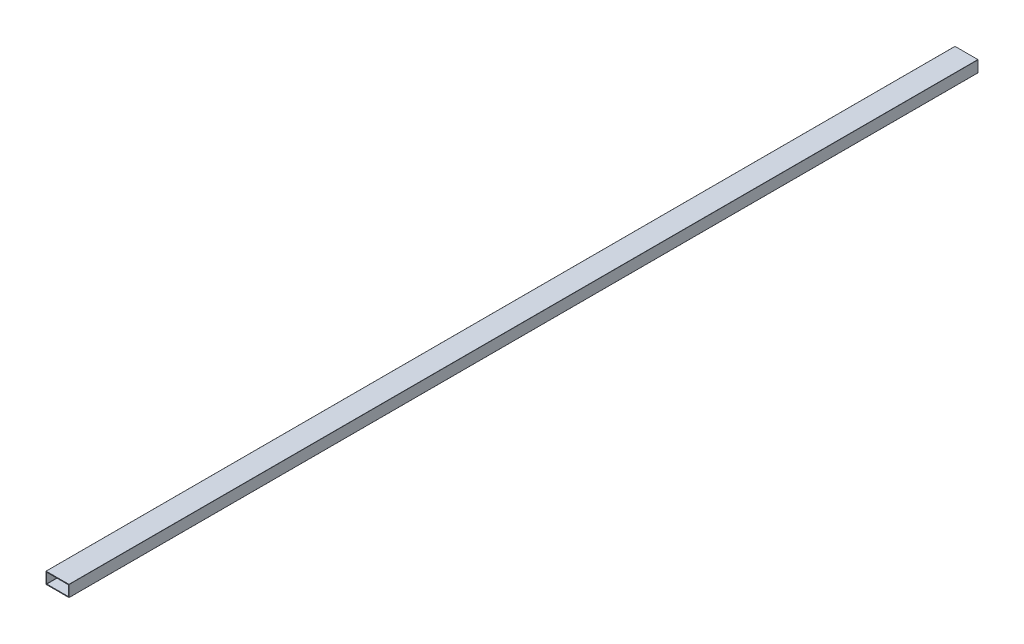
ISO-10303-21;
HEADER;
FILE_DESCRIPTION(('STEP AP214'),'2;1');
FILE_NAME('part.step','',(''),(''),'','','');
FILE_SCHEMA(('AUTOMOTIVE_DESIGN { 1 0 10303 214 1 1 1 1 }'));
ENDSEC;
DATA;
#1=APPLICATION_CONTEXT('core data for automotive mechanical design processes');
#2=APPLICATION_PROTOCOL_DEFINITION('international standard','automotive_design',2000,#1);
#3=PRODUCT_CONTEXT('',#1,'mechanical');
#4=PRODUCT('Part','Part','',(#3));
#5=PRODUCT_RELATED_PRODUCT_CATEGORY('part','',(#4));
#6=PRODUCT_DEFINITION_FORMATION('','',#4);
#7=PRODUCT_DEFINITION_CONTEXT('part definition',#1,'design');
#8=PRODUCT_DEFINITION('design','',#6,#7);
#9=PRODUCT_DEFINITION_SHAPE('','',#8);
#10=(LENGTH_UNIT() NAMED_UNIT(*) SI_UNIT(.MILLI.,.METRE.));
#11=(NAMED_UNIT(*) PLANE_ANGLE_UNIT() SI_UNIT($,.RADIAN.));
#12=(NAMED_UNIT(*) SI_UNIT($,.STERADIAN.) SOLID_ANGLE_UNIT());
#13=UNCERTAINTY_MEASURE_WITH_UNIT(LENGTH_MEASURE(1.E-05),#10,'distance_accuracy_value','');
#14=(GEOMETRIC_REPRESENTATION_CONTEXT(3) GLOBAL_UNCERTAINTY_ASSIGNED_CONTEXT((#13)) GLOBAL_UNIT_ASSIGNED_CONTEXT((#10,
#11,#12)) REPRESENTATION_CONTEXT('',''));
#15=CARTESIAN_POINT('',(0.,0.,0.));
#16=DIRECTION('',(0.,0.,1.));
#17=DIRECTION('',(1.,0.,0.));
#18=AXIS2_PLACEMENT_3D('',#15,#16,#17);
#19=CARTESIAN_POINT('',(76.2,-38.1,-6000.));
#20=DIRECTION('',(1.,0.,0.));
#21=DIRECTION('',(0.,0.,-1.));
#22=AXIS2_PLACEMENT_3D('',#19,#20,#21);
#23=PLANE('',#22);
#24=DIRECTION('',(0.,1.,0.));
#25=VECTOR('',#24,1.);
#26=CARTESIAN_POINT('',(76.2,-38.1,0.));
#27=LINE('',#26,#25);
#28=CARTESIAN_POINT('',(76.2,-37.1,0.));
#29=VERTEX_POINT('',#28);
#30=CARTESIAN_POINT('',(76.2,37.1,0.));
#31=VERTEX_POINT('',#30);
#32=EDGE_CURVE('E197',#29,#31,#27,.T.);
#33=ORIENTED_EDGE('',*,*,#32,.F.);
#34=DIRECTION('',(0.,0.,1.));
#35=VECTOR('',#34,1.);
#36=CARTESIAN_POINT('',(76.2,-37.1,-6000.));
#37=LINE('',#36,#35);
#38=CARTESIAN_POINT('',(76.2,-37.1,-6000.));
#39=VERTEX_POINT('',#38);
#40=EDGE_CURVE('E158',#29,#39,#37,.F.);
#41=ORIENTED_EDGE('',*,*,#40,.T.);
#42=DIRECTION('',(0.,1.,0.));
#43=VECTOR('',#42,1.);
#44=CARTESIAN_POINT('',(76.2,-38.1,-6000.));
#45=LINE('',#44,#43);
#46=CARTESIAN_POINT('',(76.2,37.1,-6000.));
#47=VERTEX_POINT('',#46);
#48=EDGE_CURVE('E185',#39,#47,#45,.T.);
#49=ORIENTED_EDGE('',*,*,#48,.T.);
#50=DIRECTION('',(0.,0.,1.));
#51=VECTOR('',#50,1.);
#52=CARTESIAN_POINT('',(76.2,37.1,-6000.));
#53=LINE('',#52,#51);
#54=EDGE_CURVE('E251',#47,#31,#53,.T.);
#55=ORIENTED_EDGE('',*,*,#54,.T.);
#56=EDGE_LOOP('',(#33,#41,#49,#55));
#57=FACE_BOUND('',#56,.T.);
#58=ADVANCED_FACE('F33',(#57),#23,.T.);
#59=CARTESIAN_POINT('',(-76.2,-38.1,-6000.));
#60=DIRECTION('',(0.,-1.,0.));
#61=DIRECTION('',(0.,0.,-1.));
#62=AXIS2_PLACEMENT_3D('',#59,#60,#61);
#63=PLANE('',#62);
#64=DIRECTION('',(1.,0.,0.));
#65=VECTOR('',#64,1.);
#66=CARTESIAN_POINT('',(-76.2,-38.1,0.));
#67=LINE('',#66,#65);
#68=CARTESIAN_POINT('',(-75.2,-38.1,0.));
#69=VERTEX_POINT('',#68);
#70=CARTESIAN_POINT('',(75.1999999999999,-38.1,0.));
#71=VERTEX_POINT('',#70);
#72=EDGE_CURVE('E189',#69,#71,#67,.T.);
#73=ORIENTED_EDGE('',*,*,#72,.F.);
#74=DIRECTION('',(0.,0.,1.));
#75=VECTOR('',#74,1.);
#76=CARTESIAN_POINT('',(-75.2,-38.1,-6000.));
#77=LINE('',#76,#75);
#78=CARTESIAN_POINT('',(-75.2,-38.1,-6000.));
#79=VERTEX_POINT('',#78);
#80=EDGE_CURVE('E238',#69,#79,#77,.F.);
#81=ORIENTED_EDGE('',*,*,#80,.T.);
#82=DIRECTION('',(1.,0.,0.));
#83=VECTOR('',#82,1.);
#84=CARTESIAN_POINT('',(-76.2,-38.1,-6000.));
#85=LINE('',#84,#83);
#86=CARTESIAN_POINT('',(75.1999999999999,-38.1,-6000.));
#87=VERTEX_POINT('',#86);
#88=EDGE_CURVE('E194',#79,#87,#85,.T.);
#89=ORIENTED_EDGE('',*,*,#88,.T.);
#90=DIRECTION('',(0.,0.,1.));
#91=VECTOR('',#90,1.);
#92=CARTESIAN_POINT('',(75.2,-38.1,-6000.));
#93=LINE('',#92,#91);
#94=EDGE_CURVE('E235',#87,#71,#93,.T.);
#95=ORIENTED_EDGE('',*,*,#94,.T.);
#96=EDGE_LOOP('',(#73,#81,#89,#95));
#97=FACE_BOUND('',#96,.T.);
#98=ADVANCED_FACE('F305',(#97),#63,.T.);
#99=CARTESIAN_POINT('',(-76.2,-38.1,-6000.));
#100=DIRECTION('',(-1.,0.,0.));
#101=DIRECTION('',(0.,0.,1.));
#102=AXIS2_PLACEMENT_3D('',#99,#100,#101);
#103=PLANE('',#102);
#104=DIRECTION('',(0.,-1.,0.));
#105=VECTOR('',#104,1.);
#106=CARTESIAN_POINT('',(-76.2,-38.1,-6000.));
#107=LINE('',#106,#105);
#108=CARTESIAN_POINT('',(-76.2,37.1,-6000.));
#109=VERTEX_POINT('',#108);
#110=CARTESIAN_POINT('',(-76.2,-37.1,-6000.));
#111=VERTEX_POINT('',#110);
#112=EDGE_CURVE('E191',#109,#111,#107,.T.);
#113=ORIENTED_EDGE('',*,*,#112,.T.);
#114=DIRECTION('',(0.,0.,1.));
#115=VECTOR('',#114,1.);
#116=CARTESIAN_POINT('',(-76.2,-37.1,-6000.));
#117=LINE('',#116,#115);
#118=CARTESIAN_POINT('',(-76.2,-37.1,0.));
#119=VERTEX_POINT('',#118);
#120=EDGE_CURVE('E224',#111,#119,#117,.T.);
#121=ORIENTED_EDGE('',*,*,#120,.T.);
#122=DIRECTION('',(0.,-1.,0.));
#123=VECTOR('',#122,1.);
#124=CARTESIAN_POINT('',(-76.2,-38.1,0.));
#125=LINE('',#124,#123);
#126=CARTESIAN_POINT('',(-76.2,37.1,0.));
#127=VERTEX_POINT('',#126);
#128=EDGE_CURVE('E203',#127,#119,#125,.T.);
#129=ORIENTED_EDGE('',*,*,#128,.F.);
#130=DIRECTION('',(0.,0.,1.));
#131=VECTOR('',#130,1.);
#132=CARTESIAN_POINT('',(-76.2,37.1,-6000.));
#133=LINE('',#132,#131);
#134=EDGE_CURVE('E222',#127,#109,#133,.F.);
#135=ORIENTED_EDGE('',*,*,#134,.T.);
#136=EDGE_LOOP('',(#113,#121,#129,#135));
#137=FACE_BOUND('',#136,.T.);
#138=ADVANCED_FACE('F311',(#137),#103,.T.);
#139=CARTESIAN_POINT('',(-76.2,38.1,-6000.));
#140=DIRECTION('',(0.,1.,0.));
#141=DIRECTION('',(0.,0.,1.));
#142=AXIS2_PLACEMENT_3D('',#139,#140,#141);
#143=PLANE('',#142);
#144=DIRECTION('',(-1.,0.,0.));
#145=VECTOR('',#144,1.);
#146=CARTESIAN_POINT('',(-76.2,38.1,-6000.));
#147=LINE('',#146,#145);
#148=CARTESIAN_POINT('',(75.1999999999999,38.1,-6000.));
#149=VERTEX_POINT('',#148);
#150=CARTESIAN_POINT('',(-75.2,38.1,-6000.));
#151=VERTEX_POINT('',#150);
#152=EDGE_CURVE('E188',#149,#151,#147,.T.);
#153=ORIENTED_EDGE('',*,*,#152,.T.);
#154=DIRECTION('',(0.,0.,1.));
#155=VECTOR('',#154,1.);
#156=CARTESIAN_POINT('',(-75.2,38.1,-6000.));
#157=LINE('',#156,#155);
#158=CARTESIAN_POINT('',(-75.2,38.1,0.));
#159=VERTEX_POINT('',#158);
#160=EDGE_CURVE('E248',#151,#159,#157,.T.);
#161=ORIENTED_EDGE('',*,*,#160,.T.);
#162=DIRECTION('',(-1.,0.,0.));
#163=VECTOR('',#162,1.);
#164=CARTESIAN_POINT('',(-76.2,38.1,0.));
#165=LINE('',#164,#163);
#166=CARTESIAN_POINT('',(75.1999999999999,38.1,0.));
#167=VERTEX_POINT('',#166);
#168=EDGE_CURVE('E200',#167,#159,#165,.T.);
#169=ORIENTED_EDGE('',*,*,#168,.F.);
#170=DIRECTION('',(0.,0.,1.));
#171=VECTOR('',#170,1.);
#172=CARTESIAN_POINT('',(75.2,38.1,-6000.));
#173=LINE('',#172,#171);
#174=EDGE_CURVE('E55',#167,#149,#173,.F.);
#175=ORIENTED_EDGE('',*,*,#174,.T.);
#176=EDGE_LOOP('',(#153,#161,#169,#175));
#177=FACE_BOUND('',#176,.T.);
#178=ADVANCED_FACE('F316',(#177),#143,.T.);
#179=CARTESIAN_POINT('',(0.,0.,-6000.));
#180=DIRECTION('',(0.,0.,-1.));
#181=DIRECTION('',(-1.,0.,0.));
#182=AXIS2_PLACEMENT_3D('',#179,#180,#181);
#183=PLANE('',#182);
#184=DIRECTION('',(0.,-1.,0.));
#185=VECTOR('',#184,1.);
#186=CARTESIAN_POINT('',(-71.65,-33.55,-6000.));
#187=LINE('',#186,#185);
#188=CARTESIAN_POINT('',(-71.65,32.55,-6000.));
#189=VERTEX_POINT('',#188);
#190=CARTESIAN_POINT('',(-71.65,-32.55,-6000.));
#191=VERTEX_POINT('',#190);
#192=EDGE_CURVE('E167',#189,#191,#187,.T.);
#193=ORIENTED_EDGE('',*,*,#192,.T.);
#194=CARTESIAN_POINT('',(-70.65,-32.55,-6000.));
#195=DIRECTION('',(0.,0.,-1.));
#196=DIRECTION('',(-1.,0.,0.));
#197=AXIS2_PLACEMENT_3D('',#194,#195,#196);
#198=CIRCLE('',#197,1.);
#199=CARTESIAN_POINT('',(-70.65,-33.55,-6000.));
#200=VERTEX_POINT('',#199);
#201=EDGE_CURVE('E11',#191,#200,#198,.F.);
#202=ORIENTED_EDGE('',*,*,#201,.T.);
#203=DIRECTION('',(1.,0.,0.));
#204=VECTOR('',#203,1.);
#205=CARTESIAN_POINT('',(-71.65,-33.55,-6000.));
#206=LINE('',#205,#204);
#207=CARTESIAN_POINT('',(70.65,-33.55,-6000.));
#208=VERTEX_POINT('',#207);
#209=EDGE_CURVE('E175',#200,#208,#206,.T.);
#210=ORIENTED_EDGE('',*,*,#209,.T.);
#211=CARTESIAN_POINT('',(70.65,-32.55,-6000.));
#212=DIRECTION('',(0.,0.,-1.));
#213=DIRECTION('',(-1.,0.,0.));
#214=AXIS2_PLACEMENT_3D('',#211,#212,#213);
#215=CIRCLE('',#214,1.);
#216=CARTESIAN_POINT('',(71.65,-32.55,-6000.));
#217=VERTEX_POINT('',#216);
#218=EDGE_CURVE('E262',#208,#217,#215,.F.);
#219=ORIENTED_EDGE('',*,*,#218,.T.);
#220=DIRECTION('',(0.,1.,0.));
#221=VECTOR('',#220,1.);
#222=CARTESIAN_POINT('',(71.65,-33.55,-6000.));
#223=LINE('',#222,#221);
#224=CARTESIAN_POINT('',(71.65,32.55,-6000.));
#225=VERTEX_POINT('',#224);
#226=EDGE_CURVE('E179',#217,#225,#223,.T.);
#227=ORIENTED_EDGE('',*,*,#226,.T.);
#228=CARTESIAN_POINT('',(70.65,32.55,-6000.));
#229=DIRECTION('',(0.,0.,-1.));
#230=DIRECTION('',(-1.,0.,0.));
#231=AXIS2_PLACEMENT_3D('',#228,#229,#230);
#232=CIRCLE('',#231,1.);
#233=CARTESIAN_POINT('',(70.65,33.55,-6000.));
#234=VERTEX_POINT('',#233);
#235=EDGE_CURVE('E258',#225,#234,#232,.F.);
#236=ORIENTED_EDGE('',*,*,#235,.T.);
#237=DIRECTION('',(-1.,0.,0.));
#238=VECTOR('',#237,1.);
#239=CARTESIAN_POINT('',(-71.65,33.55,-6000.));
#240=LINE('',#239,#238);
#241=CARTESIAN_POINT('',(-70.65,33.55,-6000.));
#242=VERTEX_POINT('',#241);
#243=EDGE_CURVE('E277',#234,#242,#240,.T.);
#244=ORIENTED_EDGE('',*,*,#243,.T.);
#245=CARTESIAN_POINT('',(-70.65,32.55,-6000.));
#246=DIRECTION('',(0.,0.,-1.));
#247=DIRECTION('',(-1.,0.,0.));
#248=AXIS2_PLACEMENT_3D('',#245,#246,#247);
#249=CIRCLE('',#248,1.);
#250=EDGE_CURVE('E157',#242,#189,#249,.F.);
#251=ORIENTED_EDGE('',*,*,#250,.T.);
#252=EDGE_LOOP('',(#193,#202,#210,#219,#227,#236,#244,#251));
#253=FACE_BOUND('',#252,.T.);
#254=ORIENTED_EDGE('',*,*,#88,.F.);
#255=CARTESIAN_POINT('',(-75.2,-37.1,-6000.));
#256=DIRECTION('',(0.,0.,-1.));
#257=DIRECTION('',(-1.,0.,0.));
#258=AXIS2_PLACEMENT_3D('',#255,#256,#257);
#259=CIRCLE('',#258,1.);
#260=EDGE_CURVE('E245',#79,#111,#259,.T.);
#261=ORIENTED_EDGE('',*,*,#260,.T.);
#262=ORIENTED_EDGE('',*,*,#112,.F.);
#263=CARTESIAN_POINT('',(-75.2,37.1,-6000.));
#264=DIRECTION('',(0.,0.,-1.));
#265=DIRECTION('',(-1.,0.,0.));
#266=AXIS2_PLACEMENT_3D('',#263,#264,#265);
#267=CIRCLE('',#266,1.);
#268=EDGE_CURVE('E48',#109,#151,#267,.T.);
#269=ORIENTED_EDGE('',*,*,#268,.T.);
#270=ORIENTED_EDGE('',*,*,#152,.F.);
#271=CARTESIAN_POINT('',(75.2,37.1,-6000.));
#272=DIRECTION('',(0.,0.,-1.));
#273=DIRECTION('',(-1.,0.,0.));
#274=AXIS2_PLACEMENT_3D('',#271,#272,#273);
#275=CIRCLE('',#274,1.);
#276=EDGE_CURVE('E240',#149,#47,#275,.T.);
#277=ORIENTED_EDGE('',*,*,#276,.T.);
#278=ORIENTED_EDGE('',*,*,#48,.F.);
#279=CARTESIAN_POINT('',(75.2,-37.1,-6000.));
#280=DIRECTION('',(0.,0.,-1.));
#281=DIRECTION('',(-1.,0.,0.));
#282=AXIS2_PLACEMENT_3D('',#279,#280,#281);
#283=CIRCLE('',#282,1.);
#284=EDGE_CURVE('E242',#39,#87,#283,.T.);
#285=ORIENTED_EDGE('',*,*,#284,.T.);
#286=EDGE_LOOP('',(#254,#261,#262,#269,#270,#277,#278,#285));
#287=FACE_BOUND('',#286,.T.);
#288=ADVANCED_FACE('F267',(#253,#287),#183,.T.);
#289=CARTESIAN_POINT('',(0.,0.,0.));
#290=DIRECTION('',(0.,0.,-1.));
#291=DIRECTION('',(-1.,0.,0.));
#292=AXIS2_PLACEMENT_3D('',#289,#290,#291);
#293=PLANE('',#292);
#294=DIRECTION('',(0.,1.,0.));
#295=VECTOR('',#294,1.);
#296=CARTESIAN_POINT('',(71.65,-33.55,0.));
#297=LINE('',#296,#295);
#298=CARTESIAN_POINT('',(71.65,-32.55,0.));
#299=VERTEX_POINT('',#298);
#300=CARTESIAN_POINT('',(71.65,32.55,0.));
#301=VERTEX_POINT('',#300);
#302=EDGE_CURVE('E181',#299,#301,#297,.T.);
#303=ORIENTED_EDGE('',*,*,#302,.F.);
#304=CARTESIAN_POINT('',(70.65,-32.55,0.));
#305=DIRECTION('',(0.,0.,-1.));
#306=DIRECTION('',(-1.,0.,0.));
#307=AXIS2_PLACEMENT_3D('',#304,#305,#306);
#308=CIRCLE('',#307,1.);
#309=CARTESIAN_POINT('',(70.65,-33.55,0.));
#310=VERTEX_POINT('',#309);
#311=EDGE_CURVE('E260',#299,#310,#308,.T.);
#312=ORIENTED_EDGE('',*,*,#311,.T.);
#313=DIRECTION('',(1.,0.,0.));
#314=VECTOR('',#313,1.);
#315=CARTESIAN_POINT('',(-71.65,-33.55,0.));
#316=LINE('',#315,#314);
#317=CARTESIAN_POINT('',(-70.65,-33.55,0.));
#318=VERTEX_POINT('',#317);
#319=EDGE_CURVE('E281',#318,#310,#316,.T.);
#320=ORIENTED_EDGE('',*,*,#319,.F.);
#321=CARTESIAN_POINT('',(-70.65,-32.55,0.));
#322=DIRECTION('',(0.,0.,-1.));
#323=DIRECTION('',(-1.,0.,0.));
#324=AXIS2_PLACEMENT_3D('',#321,#322,#323);
#325=CIRCLE('',#324,1.);
#326=CARTESIAN_POINT('',(-71.65,-32.55,0.));
#327=VERTEX_POINT('',#326);
#328=EDGE_CURVE('E41',#318,#327,#325,.T.);
#329=ORIENTED_EDGE('',*,*,#328,.T.);
#330=DIRECTION('',(0.,-1.,0.));
#331=VECTOR('',#330,1.);
#332=CARTESIAN_POINT('',(-71.65,-33.55,0.));
#333=LINE('',#332,#331);
#334=CARTESIAN_POINT('',(-71.65,32.55,0.));
#335=VERTEX_POINT('',#334);
#336=EDGE_CURVE('E164',#335,#327,#333,.T.);
#337=ORIENTED_EDGE('',*,*,#336,.F.);
#338=CARTESIAN_POINT('',(-70.65,32.55,0.));
#339=DIRECTION('',(0.,0.,-1.));
#340=DIRECTION('',(-1.,0.,0.));
#341=AXIS2_PLACEMENT_3D('',#338,#339,#340);
#342=CIRCLE('',#341,1.);
#343=CARTESIAN_POINT('',(-70.65,33.55,0.));
#344=VERTEX_POINT('',#343);
#345=EDGE_CURVE('E147',#335,#344,#342,.T.);
#346=ORIENTED_EDGE('',*,*,#345,.T.);
#347=DIRECTION('',(-1.,0.,0.));
#348=VECTOR('',#347,1.);
#349=CARTESIAN_POINT('',(-71.65,33.55,0.));
#350=LINE('',#349,#348);
#351=CARTESIAN_POINT('',(70.65,33.55,0.));
#352=VERTEX_POINT('',#351);
#353=EDGE_CURVE('E176',#352,#344,#350,.T.);
#354=ORIENTED_EDGE('',*,*,#353,.F.);
#355=CARTESIAN_POINT('',(70.65,32.55,0.));
#356=DIRECTION('',(0.,0.,-1.));
#357=DIRECTION('',(-1.,0.,0.));
#358=AXIS2_PLACEMENT_3D('',#355,#356,#357);
#359=CIRCLE('',#358,1.);
#360=EDGE_CURVE('E256',#352,#301,#359,.T.);
#361=ORIENTED_EDGE('',*,*,#360,.T.);
#362=EDGE_LOOP('',(#303,#312,#320,#329,#337,#346,#354,#361));
#363=FACE_BOUND('',#362,.T.);
#364=ORIENTED_EDGE('',*,*,#128,.T.);
#365=CARTESIAN_POINT('',(-75.2,-37.1,0.));
#366=DIRECTION('',(0.,0.,-1.));
#367=DIRECTION('',(-1.,0.,0.));
#368=AXIS2_PLACEMENT_3D('',#365,#366,#367);
#369=CIRCLE('',#368,1.);
#370=EDGE_CURVE('E233',#119,#69,#369,.F.);
#371=ORIENTED_EDGE('',*,*,#370,.T.);
#372=ORIENTED_EDGE('',*,*,#72,.T.);
#373=CARTESIAN_POINT('',(75.2,-37.1,0.));
#374=DIRECTION('',(0.,0.,-1.));
#375=DIRECTION('',(-1.,0.,0.));
#376=AXIS2_PLACEMENT_3D('',#373,#374,#375);
#377=CIRCLE('',#376,1.);
#378=EDGE_CURVE('E229',#71,#29,#377,.F.);
#379=ORIENTED_EDGE('',*,*,#378,.T.);
#380=ORIENTED_EDGE('',*,*,#32,.T.);
#381=CARTESIAN_POINT('',(75.2,37.1,0.));
#382=DIRECTION('',(0.,0.,-1.));
#383=DIRECTION('',(-1.,0.,0.));
#384=AXIS2_PLACEMENT_3D('',#381,#382,#383);
#385=CIRCLE('',#384,1.);
#386=EDGE_CURVE('E227',#31,#167,#385,.F.);
#387=ORIENTED_EDGE('',*,*,#386,.T.);
#388=ORIENTED_EDGE('',*,*,#168,.T.);
#389=CARTESIAN_POINT('',(-75.2,37.1,0.));
#390=DIRECTION('',(0.,0.,-1.));
#391=DIRECTION('',(-1.,0.,0.));
#392=AXIS2_PLACEMENT_3D('',#389,#390,#391);
#393=CIRCLE('',#392,1.);
#394=EDGE_CURVE('E231',#159,#127,#393,.F.);
#395=ORIENTED_EDGE('',*,*,#394,.T.);
#396=EDGE_LOOP('',(#364,#371,#372,#379,#380,#387,#388,#395));
#397=FACE_BOUND('',#396,.T.);
#398=ADVANCED_FACE('F172',(#363,#397),#293,.F.);
#399=CARTESIAN_POINT('',(-71.65,-33.55,-6000.));
#400=DIRECTION('',(0.,-1.,0.));
#401=DIRECTION('',(0.,0.,-1.));
#402=AXIS2_PLACEMENT_3D('',#399,#400,#401);
#403=PLANE('',#402);
#404=ORIENTED_EDGE('',*,*,#319,.T.);
#405=DIRECTION('',(0.,0.,1.));
#406=VECTOR('',#405,1.);
#407=CARTESIAN_POINT('',(70.65,-33.55,-6000.));
#408=LINE('',#407,#406);
#409=EDGE_CURVE('E220',#310,#208,#408,.F.);
#410=ORIENTED_EDGE('',*,*,#409,.T.);
#411=ORIENTED_EDGE('',*,*,#209,.F.);
#412=DIRECTION('',(0.,0.,1.));
#413=VECTOR('',#412,1.);
#414=CARTESIAN_POINT('',(-70.65,-33.55,0.));
#415=LINE('',#414,#413);
#416=EDGE_CURVE('E217',#200,#318,#415,.T.);
#417=ORIENTED_EDGE('',*,*,#416,.T.);
#418=EDGE_LOOP('',(#404,#410,#411,#417));
#419=FACE_BOUND('',#418,.T.);
#420=ADVANCED_FACE('F283',(#419),#403,.F.);
#421=CARTESIAN_POINT('',(-71.65,-33.55,-6000.));
#422=DIRECTION('',(-1.,0.,0.));
#423=DIRECTION('',(0.,0.,1.));
#424=AXIS2_PLACEMENT_3D('',#421,#422,#423);
#425=PLANE('',#424);
#426=ORIENTED_EDGE('',*,*,#192,.F.);
#427=DIRECTION('',(0.,0.,1.));
#428=VECTOR('',#427,1.);
#429=CARTESIAN_POINT('',(-71.65,32.55,0.));
#430=LINE('',#429,#428);
#431=EDGE_CURVE('E151',#189,#335,#430,.T.);
#432=ORIENTED_EDGE('',*,*,#431,.T.);
#433=ORIENTED_EDGE('',*,*,#336,.T.);
#434=DIRECTION('',(0.,0.,1.));
#435=VECTOR('',#434,1.);
#436=CARTESIAN_POINT('',(-71.65,-32.55,-6000.));
#437=LINE('',#436,#435);
#438=EDGE_CURVE('E169',#327,#191,#437,.F.);
#439=ORIENTED_EDGE('',*,*,#438,.T.);
#440=EDGE_LOOP('',(#426,#432,#433,#439));
#441=FACE_BOUND('',#440,.T.);
#442=ADVANCED_FACE('F163',(#441),#425,.F.);
#443=CARTESIAN_POINT('',(-71.65,33.55,-6000.));
#444=DIRECTION('',(0.,1.,0.));
#445=DIRECTION('',(0.,0.,1.));
#446=AXIS2_PLACEMENT_3D('',#443,#444,#445);
#447=PLANE('',#446);
#448=ORIENTED_EDGE('',*,*,#353,.T.);
#449=DIRECTION('',(0.,0.,1.));
#450=VECTOR('',#449,1.);
#451=CARTESIAN_POINT('',(-70.65,33.55,-6000.));
#452=LINE('',#451,#450);
#453=EDGE_CURVE('E152',#344,#242,#452,.F.);
#454=ORIENTED_EDGE('',*,*,#453,.T.);
#455=ORIENTED_EDGE('',*,*,#243,.F.);
#456=DIRECTION('',(0.,0.,1.));
#457=VECTOR('',#456,1.);
#458=CARTESIAN_POINT('',(70.65,33.55,0.));
#459=LINE('',#458,#457);
#460=EDGE_CURVE('E168',#234,#352,#459,.T.);
#461=ORIENTED_EDGE('',*,*,#460,.T.);
#462=EDGE_LOOP('',(#448,#454,#455,#461));
#463=FACE_BOUND('',#462,.T.);
#464=ADVANCED_FACE('F292',(#463),#447,.F.);
#465=CARTESIAN_POINT('',(71.65,-33.55,-6000.));
#466=DIRECTION('',(1.,0.,0.));
#467=DIRECTION('',(0.,0.,-1.));
#468=AXIS2_PLACEMENT_3D('',#465,#466,#467);
#469=PLANE('',#468);
#470=ORIENTED_EDGE('',*,*,#302,.T.);
#471=DIRECTION('',(0.,0.,1.));
#472=VECTOR('',#471,1.);
#473=CARTESIAN_POINT('',(71.65,32.55,-6000.));
#474=LINE('',#473,#472);
#475=EDGE_CURVE('E215',#301,#225,#474,.F.);
#476=ORIENTED_EDGE('',*,*,#475,.T.);
#477=ORIENTED_EDGE('',*,*,#226,.F.);
#478=DIRECTION('',(0.,0.,1.));
#479=VECTOR('',#478,1.);
#480=CARTESIAN_POINT('',(71.65,-32.55,0.));
#481=LINE('',#480,#479);
#482=EDGE_CURVE('E212',#217,#299,#481,.T.);
#483=ORIENTED_EDGE('',*,*,#482,.T.);
#484=EDGE_LOOP('',(#470,#476,#477,#483));
#485=FACE_BOUND('',#484,.T.);
#486=ADVANCED_FACE('F275',(#485),#469,.F.);
#487=CARTESIAN_POINT('',(-70.65,32.55,-6000.));
#488=DIRECTION('',(0.,0.,-1.));
#489=DIRECTION('',(-1.,0.,0.));
#490=AXIS2_PLACEMENT_3D('',#487,#488,#489);
#491=CYLINDRICAL_SURFACE('',#490,1.);
#492=ORIENTED_EDGE('',*,*,#250,.F.);
#493=ORIENTED_EDGE('',*,*,#453,.F.);
#494=ORIENTED_EDGE('',*,*,#345,.F.);
#495=ORIENTED_EDGE('',*,*,#431,.F.);
#496=EDGE_LOOP('',(#492,#493,#494,#495));
#497=FACE_BOUND('',#496,.T.);
#498=ADVANCED_FACE('F150',(#497),#491,.F.);
#499=CARTESIAN_POINT('',(70.65,32.55,-6000.));
#500=DIRECTION('',(0.,0.,-1.));
#501=DIRECTION('',(-1.,0.,0.));
#502=AXIS2_PLACEMENT_3D('',#499,#500,#501);
#503=CYLINDRICAL_SURFACE('',#502,1.);
#504=ORIENTED_EDGE('',*,*,#235,.F.);
#505=ORIENTED_EDGE('',*,*,#475,.F.);
#506=ORIENTED_EDGE('',*,*,#360,.F.);
#507=ORIENTED_EDGE('',*,*,#460,.F.);
#508=EDGE_LOOP('',(#504,#505,#506,#507));
#509=FACE_BOUND('',#508,.T.);
#510=ADVANCED_FACE('F294',(#509),#503,.F.);
#511=CARTESIAN_POINT('',(70.65,-32.55,-6000.));
#512=DIRECTION('',(0.,0.,-1.));
#513=DIRECTION('',(-1.,0.,0.));
#514=AXIS2_PLACEMENT_3D('',#511,#512,#513);
#515=CYLINDRICAL_SURFACE('',#514,1.);
#516=ORIENTED_EDGE('',*,*,#218,.F.);
#517=ORIENTED_EDGE('',*,*,#409,.F.);
#518=ORIENTED_EDGE('',*,*,#311,.F.);
#519=ORIENTED_EDGE('',*,*,#482,.F.);
#520=EDGE_LOOP('',(#516,#517,#518,#519));
#521=FACE_BOUND('',#520,.T.);
#522=ADVANCED_FACE('F279',(#521),#515,.F.);
#523=CARTESIAN_POINT('',(-75.2,-37.1,-6000.));
#524=DIRECTION('',(0.,0.,1.));
#525=DIRECTION('',(1.,0.,0.));
#526=AXIS2_PLACEMENT_3D('',#523,#524,#525);
#527=CYLINDRICAL_SURFACE('',#526,1.);
#528=ORIENTED_EDGE('',*,*,#260,.F.);
#529=ORIENTED_EDGE('',*,*,#80,.F.);
#530=ORIENTED_EDGE('',*,*,#370,.F.);
#531=ORIENTED_EDGE('',*,*,#120,.F.);
#532=EDGE_LOOP('',(#528,#529,#530,#531));
#533=FACE_BOUND('',#532,.T.);
#534=ADVANCED_FACE('F301',(#533),#527,.T.);
#535=CARTESIAN_POINT('',(-75.2,37.1,-6000.));
#536=DIRECTION('',(0.,0.,1.));
#537=DIRECTION('',(1.,0.,0.));
#538=AXIS2_PLACEMENT_3D('',#535,#536,#537);
#539=CYLINDRICAL_SURFACE('',#538,1.);
#540=ORIENTED_EDGE('',*,*,#268,.F.);
#541=ORIENTED_EDGE('',*,*,#134,.F.);
#542=ORIENTED_EDGE('',*,*,#394,.F.);
#543=ORIENTED_EDGE('',*,*,#160,.F.);
#544=EDGE_LOOP('',(#540,#541,#542,#543));
#545=FACE_BOUND('',#544,.T.);
#546=ADVANCED_FACE('F368',(#545),#539,.T.);
#547=CARTESIAN_POINT('',(-70.65,-32.55,-6000.));
#548=DIRECTION('',(0.,0.,-1.));
#549=DIRECTION('',(-1.,0.,0.));
#550=AXIS2_PLACEMENT_3D('',#547,#548,#549);
#551=CYLINDRICAL_SURFACE('',#550,1.);
#552=ORIENTED_EDGE('',*,*,#201,.F.);
#553=ORIENTED_EDGE('',*,*,#438,.F.);
#554=ORIENTED_EDGE('',*,*,#328,.F.);
#555=ORIENTED_EDGE('',*,*,#416,.F.);
#556=EDGE_LOOP('',(#552,#553,#554,#555));
#557=FACE_BOUND('',#556,.T.);
#558=ADVANCED_FACE('F378',(#557),#551,.F.);
#559=CARTESIAN_POINT('',(75.2,-37.1,-6000.));
#560=DIRECTION('',(0.,0.,1.));
#561=DIRECTION('',(1.,0.,0.));
#562=AXIS2_PLACEMENT_3D('',#559,#560,#561);
#563=CYLINDRICAL_SURFACE('',#562,1.);
#564=ORIENTED_EDGE('',*,*,#284,.F.);
#565=ORIENTED_EDGE('',*,*,#40,.F.);
#566=ORIENTED_EDGE('',*,*,#378,.F.);
#567=ORIENTED_EDGE('',*,*,#94,.F.);
#568=EDGE_LOOP('',(#564,#565,#566,#567));
#569=FACE_BOUND('',#568,.T.);
#570=ADVANCED_FACE('F388',(#569),#563,.T.);
#571=CARTESIAN_POINT('',(75.2,37.1,-6000.));
#572=DIRECTION('',(0.,0.,1.));
#573=DIRECTION('',(1.,0.,0.));
#574=AXIS2_PLACEMENT_3D('',#571,#572,#573);
#575=CYLINDRICAL_SURFACE('',#574,1.);
#576=ORIENTED_EDGE('',*,*,#276,.F.);
#577=ORIENTED_EDGE('',*,*,#174,.F.);
#578=ORIENTED_EDGE('',*,*,#386,.F.);
#579=ORIENTED_EDGE('',*,*,#54,.F.);
#580=EDGE_LOOP('',(#576,#577,#578,#579));
#581=FACE_BOUND('',#580,.T.);
#582=ADVANCED_FACE('F35',(#581),#575,.T.);
#583=CLOSED_SHELL('',(#58,#98,#138,#178,#288,#398,#420,#442,#464,#486,#498,#510,#522,#534,#546,
#558,#570,#582));
#584=MANIFOLD_SOLID_BREP('B2',#583);
#585=ADVANCED_BREP_SHAPE_REPRESENTATION('',(#18,#584),#14);
#586=SHAPE_DEFINITION_REPRESENTATION(#9,#585);
ENDSEC;
END-ISO-10303-21;
